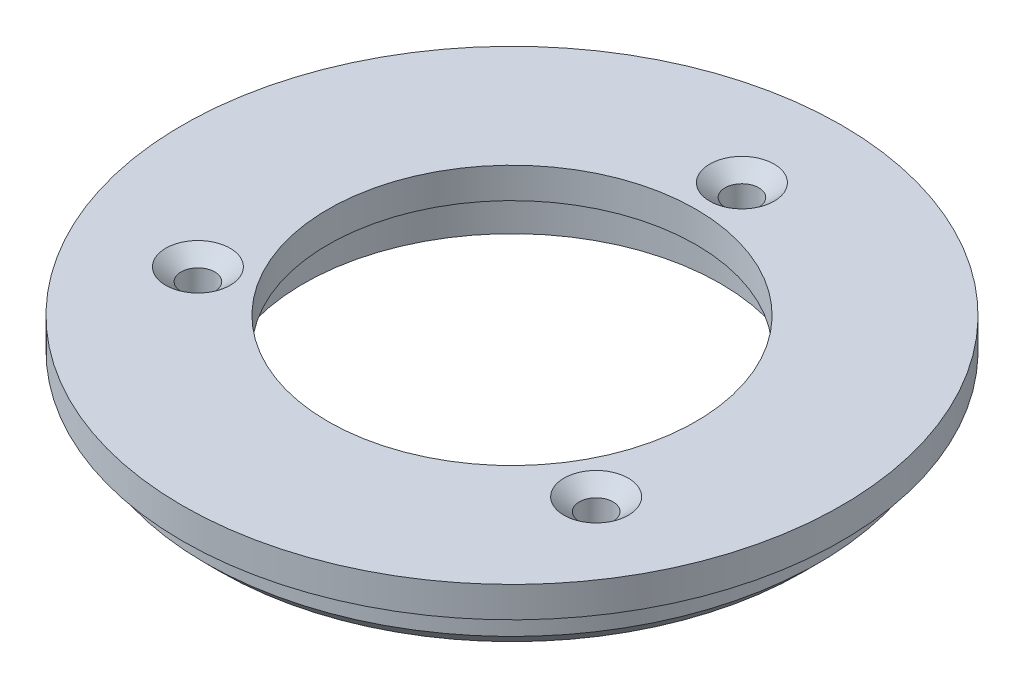
ISO-10303-21;
HEADER;
FILE_DESCRIPTION(('STEP AP214'),'2;1');
FILE_NAME('part.step','',(''),(''),'','','');
FILE_SCHEMA(('AUTOMOTIVE_DESIGN { 1 0 10303 214 1 1 1 1 }'));
ENDSEC;
DATA;
#1=APPLICATION_CONTEXT('core data for automotive mechanical design processes');
#2=APPLICATION_PROTOCOL_DEFINITION('international standard','automotive_design',2000,#1);
#3=PRODUCT_CONTEXT('',#1,'mechanical');
#4=PRODUCT('Part','Part','',(#3));
#5=PRODUCT_RELATED_PRODUCT_CATEGORY('part','',(#4));
#6=PRODUCT_DEFINITION_FORMATION('','',#4);
#7=PRODUCT_DEFINITION_CONTEXT('part definition',#1,'design');
#8=PRODUCT_DEFINITION('design','',#6,#7);
#9=PRODUCT_DEFINITION_SHAPE('','',#8);
#10=(LENGTH_UNIT() NAMED_UNIT(*) SI_UNIT(.MILLI.,.METRE.));
#11=(NAMED_UNIT(*) PLANE_ANGLE_UNIT() SI_UNIT($,.RADIAN.));
#12=(NAMED_UNIT(*) SI_UNIT($,.STERADIAN.) SOLID_ANGLE_UNIT());
#13=UNCERTAINTY_MEASURE_WITH_UNIT(LENGTH_MEASURE(1.E-05),#10,'distance_accuracy_value','');
#14=(GEOMETRIC_REPRESENTATION_CONTEXT(3) GLOBAL_UNCERTAINTY_ASSIGNED_CONTEXT((#13)) GLOBAL_UNIT_ASSIGNED_CONTEXT((#10,
#11,#12)) REPRESENTATION_CONTEXT('',''));
#15=CARTESIAN_POINT('',(0.,0.,0.));
#16=DIRECTION('',(0.,0.,1.));
#17=DIRECTION('',(1.,0.,0.));
#18=AXIS2_PLACEMENT_3D('',#15,#16,#17);
#19=CARTESIAN_POINT('',(0.,-5.,0.));
#20=DIRECTION('',(0.,-1.,0.));
#21=DIRECTION('',(0.,0.,-1.));
#22=AXIS2_PLACEMENT_3D('',#19,#20,#21);
#23=PLANE('',#22);
#24=CARTESIAN_POINT('',(0.,-5.,0.));
#25=DIRECTION('',(0.,-1.,0.));
#26=DIRECTION('',(0.,0.,-1.));
#27=AXIS2_PLACEMENT_3D('',#24,#25,#26);
#28=CIRCLE('',#27,13.6);
#29=CARTESIAN_POINT('',(0.,-5.,-13.6));
#30=VERTEX_POINT('',#29);
#31=EDGE_CURVE('E79',#30,#30,#28,.T.);
#32=ORIENTED_EDGE('',*,*,#31,.F.);
#33=EDGE_LOOP('',(#32));
#34=FACE_BOUND('',#33,.T.);
#35=CARTESIAN_POINT('',(0.,-5.,0.));
#36=DIRECTION('',(0.,-1.,0.));
#37=DIRECTION('',(0.,0.,-1.));
#38=AXIS2_PLACEMENT_3D('',#35,#36,#37);
#39=CIRCLE('',#38,19.);
#40=CARTESIAN_POINT('',(0.,-5.,-19.));
#41=VERTEX_POINT('',#40);
#42=EDGE_CURVE('E54',#41,#41,#39,.T.);
#43=ORIENTED_EDGE('',*,*,#42,.T.);
#44=EDGE_LOOP('',(#43));
#45=FACE_BOUND('',#44,.T.);
#46=CARTESIAN_POINT('',(-12.9903810567656,-5.,7.50000000000055));
#47=DIRECTION('',(0.,1.,0.));
#48=DIRECTION('',(0.,0.,1.));
#49=AXIS2_PLACEMENT_3D('',#46,#47,#48);
#50=CIRCLE('',#49,1.099999959);
#51=CARTESIAN_POINT('',(-12.9903810567656,-5.,8.59999995900055));
#52=VERTEX_POINT('',#51);
#53=EDGE_CURVE('E87',#52,#52,#50,.T.);
#54=ORIENTED_EDGE('',*,*,#53,.T.);
#55=EDGE_LOOP('',(#54));
#56=FACE_BOUND('',#55,.T.);
#57=CARTESIAN_POINT('',(12.9903810567675,-5.,7.49999999999945));
#58=DIRECTION('',(0.,1.,0.));
#59=DIRECTION('',(0.,0.,1.));
#60=AXIS2_PLACEMENT_3D('',#57,#58,#59);
#61=CIRCLE('',#60,1.099999959);
#62=CARTESIAN_POINT('',(12.9903810567675,-5.,8.59999995899945));
#63=VERTEX_POINT('',#62);
#64=EDGE_CURVE('E102',#63,#63,#61,.T.);
#65=ORIENTED_EDGE('',*,*,#64,.T.);
#66=EDGE_LOOP('',(#65));
#67=FACE_BOUND('',#66,.T.);
#68=CARTESIAN_POINT('',(0.,-5.,-15.));
#69=DIRECTION('',(0.,1.,0.));
#70=DIRECTION('',(0.,0.,1.));
#71=AXIS2_PLACEMENT_3D('',#68,#69,#70);
#72=CIRCLE('',#71,1.099999959);
#73=CARTESIAN_POINT('',(0.,-5.,-13.900000041));
#74=VERTEX_POINT('',#73);
#75=EDGE_CURVE('E114',#74,#74,#72,.T.);
#76=ORIENTED_EDGE('',*,*,#75,.T.);
#77=EDGE_LOOP('',(#76));
#78=FACE_BOUND('',#77,.T.);
#79=ADVANCED_FACE('F45',(#34,#45,#56,#67,#78),#23,.T.);
#80=CARTESIAN_POINT('',(0.,-2.,0.));
#81=DIRECTION('',(0.,1.,0.));
#82=DIRECTION('',(0.,0.,1.));
#83=AXIS2_PLACEMENT_3D('',#80,#81,#82);
#84=PLANE('',#83);
#85=CARTESIAN_POINT('',(0.,-2.,0.));
#86=DIRECTION('',(0.,1.,0.));
#87=DIRECTION('',(0.,0.,1.));
#88=AXIS2_PLACEMENT_3D('',#85,#86,#87);
#89=CIRCLE('',#88,12.);
#90=CARTESIAN_POINT('',(0.,-2.,12.));
#91=VERTEX_POINT('',#90);
#92=EDGE_CURVE('E71',#91,#91,#89,.T.);
#93=ORIENTED_EDGE('',*,*,#92,.T.);
#94=EDGE_LOOP('',(#93));
#95=FACE_BOUND('',#94,.T.);
#96=CARTESIAN_POINT('',(0.,-2.,0.));
#97=DIRECTION('',(0.,-1.,0.));
#98=DIRECTION('',(0.,0.,-1.));
#99=AXIS2_PLACEMENT_3D('',#96,#97,#98);
#100=CIRCLE('',#99,13.6);
#101=CARTESIAN_POINT('',(0.,-2.,-13.6));
#102=VERTEX_POINT('',#101);
#103=EDGE_CURVE('E83',#102,#102,#100,.T.);
#104=ORIENTED_EDGE('',*,*,#103,.T.);
#105=EDGE_LOOP('',(#104));
#106=FACE_BOUND('',#105,.T.);
#107=ADVANCED_FACE('F145',(#95,#106),#84,.F.);
#108=CARTESIAN_POINT('',(0.,-2.,0.));
#109=DIRECTION('',(0.,1.,0.));
#110=DIRECTION('',(0.,0.,1.));
#111=AXIS2_PLACEMENT_3D('',#108,#109,#110);
#112=CYLINDRICAL_SURFACE('',#111,21.5);
#113=CARTESIAN_POINT('',(0.,-2.,0.));
#114=DIRECTION('',(0.,1.,0.));
#115=DIRECTION('',(0.,0.,1.));
#116=AXIS2_PLACEMENT_3D('',#113,#114,#115);
#117=CIRCLE('',#116,21.5);
#118=CARTESIAN_POINT('',(0.,-2.,21.5));
#119=VERTEX_POINT('',#118);
#120=EDGE_CURVE('E64',#119,#119,#117,.T.);
#121=ORIENTED_EDGE('',*,*,#120,.T.);
#122=EDGE_LOOP('',(#121));
#123=FACE_BOUND('',#122,.T.);
#124=CARTESIAN_POINT('',(0.,0.,0.));
#125=DIRECTION('',(0.,1.,0.));
#126=DIRECTION('',(0.,0.,1.));
#127=AXIS2_PLACEMENT_3D('',#124,#125,#126);
#128=CIRCLE('',#127,21.5);
#129=CARTESIAN_POINT('',(0.,0.,21.5));
#130=VERTEX_POINT('',#129);
#131=EDGE_CURVE('E67',#130,#130,#128,.T.);
#132=ORIENTED_EDGE('',*,*,#131,.F.);
#133=EDGE_LOOP('',(#132));
#134=FACE_BOUND('',#133,.T.);
#135=ADVANCED_FACE('F143',(#123,#134),#112,.T.);
#136=CARTESIAN_POINT('',(0.,-2.,0.));
#137=DIRECTION('',(0.,-1.,0.));
#138=DIRECTION('',(0.,0.,-1.));
#139=AXIS2_PLACEMENT_3D('',#136,#137,#138);
#140=CIRCLE('',#139,20.);
#141=CARTESIAN_POINT('',(0.,-2.,-20.));
#142=VERTEX_POINT('',#141);
#143=EDGE_CURVE('E59',#142,#142,#140,.T.);
#144=ORIENTED_EDGE('',*,*,#143,.F.);
#145=EDGE_LOOP('',(#144));
#146=FACE_BOUND('',#145,.T.);
#147=ORIENTED_EDGE('',*,*,#120,.F.);
#148=EDGE_LOOP('',(#147));
#149=FACE_BOUND('',#148,.T.);
#150=ADVANCED_FACE('F133',(#146,#149),#84,.F.);
#151=CARTESIAN_POINT('',(0.,0.,0.));
#152=DIRECTION('',(0.,1.,0.));
#153=DIRECTION('',(0.,0.,1.));
#154=AXIS2_PLACEMENT_3D('',#151,#152,#153);
#155=PLANE('',#154);
#156=CARTESIAN_POINT('',(0.,0.,-15.));
#157=DIRECTION('',(0.,1.,0.));
#158=DIRECTION('',(0.,0.,1.));
#159=AXIS2_PLACEMENT_3D('',#156,#157,#158);
#160=CIRCLE('',#159,2.099999991);
#161=CARTESIAN_POINT('',(0.,0.,-12.900000009));
#162=VERTEX_POINT('',#161);
#163=EDGE_CURVE('E122',#162,#162,#160,.T.);
#164=ORIENTED_EDGE('',*,*,#163,.F.);
#165=EDGE_LOOP('',(#164));
#166=FACE_BOUND('',#165,.T.);
#167=CARTESIAN_POINT('',(12.9903810567675,0.,7.49999999999945));
#168=DIRECTION('',(0.,1.,0.));
#169=DIRECTION('',(0.,0.,1.));
#170=AXIS2_PLACEMENT_3D('',#167,#168,#169);
#171=CIRCLE('',#170,2.099999991);
#172=CARTESIAN_POINT('',(12.9903810567675,0.,9.59999999099945));
#173=VERTEX_POINT('',#172);
#174=EDGE_CURVE('E110',#173,#173,#171,.T.);
#175=ORIENTED_EDGE('',*,*,#174,.F.);
#176=EDGE_LOOP('',(#175));
#177=FACE_BOUND('',#176,.T.);
#178=CARTESIAN_POINT('',(-12.9903810567656,0.,7.50000000000055));
#179=DIRECTION('',(0.,1.,0.));
#180=DIRECTION('',(0.,0.,1.));
#181=AXIS2_PLACEMENT_3D('',#178,#179,#180);
#182=CIRCLE('',#181,2.099999991);
#183=CARTESIAN_POINT('',(-12.9903810567656,0.,9.59999999100055));
#184=VERTEX_POINT('',#183);
#185=EDGE_CURVE('E98',#184,#184,#182,.T.);
#186=ORIENTED_EDGE('',*,*,#185,.F.);
#187=EDGE_LOOP('',(#186));
#188=FACE_BOUND('',#187,.T.);
#189=CARTESIAN_POINT('',(0.,0.,0.));
#190=DIRECTION('',(0.,1.,0.));
#191=DIRECTION('',(0.,0.,1.));
#192=AXIS2_PLACEMENT_3D('',#189,#190,#191);
#193=CIRCLE('',#192,12.);
#194=CARTESIAN_POINT('',(0.,0.,12.));
#195=VERTEX_POINT('',#194);
#196=EDGE_CURVE('E75',#195,#195,#193,.T.);
#197=ORIENTED_EDGE('',*,*,#196,.F.);
#198=EDGE_LOOP('',(#197));
#199=FACE_BOUND('',#198,.T.);
#200=ORIENTED_EDGE('',*,*,#131,.T.);
#201=EDGE_LOOP('',(#200));
#202=FACE_BOUND('',#201,.T.);
#203=ADVANCED_FACE('F129',(#166,#177,#188,#199,#202),#155,.T.);
#204=CARTESIAN_POINT('',(0.,-2.,0.));
#205=DIRECTION('',(0.,1.,0.));
#206=DIRECTION('',(0.,0.,1.));
#207=AXIS2_PLACEMENT_3D('',#204,#205,#206);
#208=CYLINDRICAL_SURFACE('',#207,12.);
#209=ORIENTED_EDGE('',*,*,#92,.F.);
#210=EDGE_LOOP('',(#209));
#211=FACE_BOUND('',#210,.T.);
#212=ORIENTED_EDGE('',*,*,#196,.T.);
#213=EDGE_LOOP('',(#212));
#214=FACE_BOUND('',#213,.T.);
#215=ADVANCED_FACE('F132',(#211,#214),#208,.F.);
#216=CARTESIAN_POINT('',(0.,-5.,0.));
#217=DIRECTION('',(0.,1.,0.));
#218=DIRECTION('',(0.,0.,1.));
#219=AXIS2_PLACEMENT_3D('',#216,#217,#218);
#220=CYLINDRICAL_SURFACE('',#219,20.);
#221=CARTESIAN_POINT('',(0.,-4.,0.));
#222=DIRECTION('',(0.,-1.,0.));
#223=DIRECTION('',(0.,0.,-1.));
#224=AXIS2_PLACEMENT_3D('',#221,#222,#223);
#225=CIRCLE('',#224,20.);
#226=CARTESIAN_POINT('',(0.,-4.,-20.));
#227=VERTEX_POINT('',#226);
#228=EDGE_CURVE('E10',#227,#227,#225,.F.);
#229=ORIENTED_EDGE('',*,*,#228,.T.);
#230=EDGE_LOOP('',(#229));
#231=FACE_BOUND('',#230,.T.);
#232=ORIENTED_EDGE('',*,*,#143,.T.);
#233=EDGE_LOOP('',(#232));
#234=FACE_BOUND('',#233,.T.);
#235=ADVANCED_FACE('F166',(#231,#234),#220,.T.);
#236=CARTESIAN_POINT('',(0.,-5.,0.));
#237=DIRECTION('',(0.,1.,0.));
#238=DIRECTION('',(0.,0.,1.));
#239=AXIS2_PLACEMENT_3D('',#236,#237,#238);
#240=CYLINDRICAL_SURFACE('',#239,13.6);
#241=ORIENTED_EDGE('',*,*,#31,.T.);
#242=EDGE_LOOP('',(#241));
#243=FACE_BOUND('',#242,.T.);
#244=ORIENTED_EDGE('',*,*,#103,.F.);
#245=EDGE_LOOP('',(#244));
#246=FACE_BOUND('',#245,.T.);
#247=ADVANCED_FACE('F164',(#243,#246),#240,.F.);
#248=CARTESIAN_POINT('',(0.,-5.,0.));
#249=DIRECTION('',(0.,1.,0.));
#250=DIRECTION('',(0.,0.,1.));
#251=AXIS2_PLACEMENT_3D('',#248,#249,#250);
#252=CONICAL_SURFACE('',#251,19.,0.785398163397448);
#253=ORIENTED_EDGE('',*,*,#228,.F.);
#254=EDGE_LOOP('',(#253));
#255=FACE_BOUND('',#254,.T.);
#256=ORIENTED_EDGE('',*,*,#42,.F.);
#257=EDGE_LOOP('',(#256));
#258=FACE_BOUND('',#257,.T.);
#259=ADVANCED_FACE('F48',(#255,#258),#252,.T.);
#260=CARTESIAN_POINT('',(-12.9903810567656,0.,7.50000000000055));
#261=DIRECTION('',(0.,1.,0.));
#262=DIRECTION('',(0.,0.,1.));
#263=AXIS2_PLACEMENT_3D('',#260,#261,#262);
#264=CYLINDRICAL_SURFACE('',#263,1.099999959);
#265=ORIENTED_EDGE('',*,*,#53,.F.);
#266=EDGE_LOOP('',(#265));
#267=FACE_BOUND('',#266,.T.);
#268=CARTESIAN_POINT('',(-12.9903810567656,-0.839099658028468,7.50000000000055));
#269=DIRECTION('',(0.,1.,0.));
#270=DIRECTION('',(0.,0.,1.));
#271=AXIS2_PLACEMENT_3D('',#268,#269,#270);
#272=CIRCLE('',#271,1.099999959);
#273=CARTESIAN_POINT('',(-12.9903810567656,-0.839099658028468,8.59999995900055));
#274=VERTEX_POINT('',#273);
#275=EDGE_CURVE('E94',#274,#274,#272,.T.);
#276=ORIENTED_EDGE('',*,*,#275,.T.);
#277=EDGE_LOOP('',(#276));
#278=FACE_BOUND('',#277,.T.);
#279=ADVANCED_FACE('F181',(#267,#278),#264,.F.);
#280=CARTESIAN_POINT('',(-12.9903810567656,0.,7.50000000000055));
#281=DIRECTION('',(0.,1.,0.));
#282=DIRECTION('',(0.,0.,1.));
#283=AXIS2_PLACEMENT_3D('',#280,#281,#282);
#284=CONICAL_SURFACE('',#283,2.099999991,0.872664625997164);
#285=ORIENTED_EDGE('',*,*,#275,.F.);
#286=EDGE_LOOP('',(#285));
#287=FACE_BOUND('',#286,.T.);
#288=ORIENTED_EDGE('',*,*,#185,.T.);
#289=EDGE_LOOP('',(#288));
#290=FACE_BOUND('',#289,.T.);
#291=ADVANCED_FACE('F186',(#287,#290),#284,.F.);
#292=CARTESIAN_POINT('',(12.9903810567675,0.,7.49999999999945));
#293=DIRECTION('',(0.,1.,0.));
#294=DIRECTION('',(0.,0.,1.));
#295=AXIS2_PLACEMENT_3D('',#292,#293,#294);
#296=CYLINDRICAL_SURFACE('',#295,1.099999959);
#297=ORIENTED_EDGE('',*,*,#64,.F.);
#298=EDGE_LOOP('',(#297));
#299=FACE_BOUND('',#298,.T.);
#300=CARTESIAN_POINT('',(12.9903810567675,-0.839099658028468,7.49999999999945));
#301=DIRECTION('',(0.,1.,0.));
#302=DIRECTION('',(0.,0.,1.));
#303=AXIS2_PLACEMENT_3D('',#300,#301,#302);
#304=CIRCLE('',#303,1.099999959);
#305=CARTESIAN_POINT('',(12.9903810567675,-0.839099658028468,8.59999995899945));
#306=VERTEX_POINT('',#305);
#307=EDGE_CURVE('E106',#306,#306,#304,.T.);
#308=ORIENTED_EDGE('',*,*,#307,.T.);
#309=EDGE_LOOP('',(#308));
#310=FACE_BOUND('',#309,.T.);
#311=ADVANCED_FACE('F192',(#299,#310),#296,.F.);
#312=CARTESIAN_POINT('',(12.9903810567675,0.,7.49999999999945));
#313=DIRECTION('',(0.,1.,0.));
#314=DIRECTION('',(0.,0.,1.));
#315=AXIS2_PLACEMENT_3D('',#312,#313,#314);
#316=CONICAL_SURFACE('',#315,2.099999991,0.872664625997165);
#317=ORIENTED_EDGE('',*,*,#307,.F.);
#318=EDGE_LOOP('',(#317));
#319=FACE_BOUND('',#318,.T.);
#320=ORIENTED_EDGE('',*,*,#174,.T.);
#321=EDGE_LOOP('',(#320));
#322=FACE_BOUND('',#321,.T.);
#323=ADVANCED_FACE('F200',(#319,#322),#316,.F.);
#324=CARTESIAN_POINT('',(0.,0.,-15.));
#325=DIRECTION('',(0.,1.,0.));
#326=DIRECTION('',(0.,0.,1.));
#327=AXIS2_PLACEMENT_3D('',#324,#325,#326);
#328=CYLINDRICAL_SURFACE('',#327,1.099999959);
#329=ORIENTED_EDGE('',*,*,#75,.F.);
#330=EDGE_LOOP('',(#329));
#331=FACE_BOUND('',#330,.T.);
#332=CARTESIAN_POINT('',(0.,-0.839099658028468,-15.));
#333=DIRECTION('',(0.,1.,0.));
#334=DIRECTION('',(0.,0.,1.));
#335=AXIS2_PLACEMENT_3D('',#332,#333,#334);
#336=CIRCLE('',#335,1.099999959);
#337=CARTESIAN_POINT('',(0.,-0.839099658028468,-13.900000041));
#338=VERTEX_POINT('',#337);
#339=EDGE_CURVE('E118',#338,#338,#336,.T.);
#340=ORIENTED_EDGE('',*,*,#339,.T.);
#341=EDGE_LOOP('',(#340));
#342=FACE_BOUND('',#341,.T.);
#343=ADVANCED_FACE('F204',(#331,#342),#328,.F.);
#344=CARTESIAN_POINT('',(0.,0.,-15.));
#345=DIRECTION('',(0.,1.,0.));
#346=DIRECTION('',(0.,0.,1.));
#347=AXIS2_PLACEMENT_3D('',#344,#345,#346);
#348=CONICAL_SURFACE('',#347,2.099999991,0.872664625997165);
#349=ORIENTED_EDGE('',*,*,#339,.F.);
#350=EDGE_LOOP('',(#349));
#351=FACE_BOUND('',#350,.T.);
#352=ORIENTED_EDGE('',*,*,#163,.T.);
#353=EDGE_LOOP('',(#352));
#354=FACE_BOUND('',#353,.T.);
#355=ADVANCED_FACE('F127',(#351,#354),#348,.F.);
#356=CLOSED_SHELL('',(#79,#107,#135,#150,#203,#215,#235,#247,#259,#279,#291,#311,#323,#343,#355));
#357=MANIFOLD_SOLID_BREP('B2',#356);
#358=ADVANCED_BREP_SHAPE_REPRESENTATION('',(#18,#357),#14);
#359=SHAPE_DEFINITION_REPRESENTATION(#9,#358);
ENDSEC;
END-ISO-10303-21;
